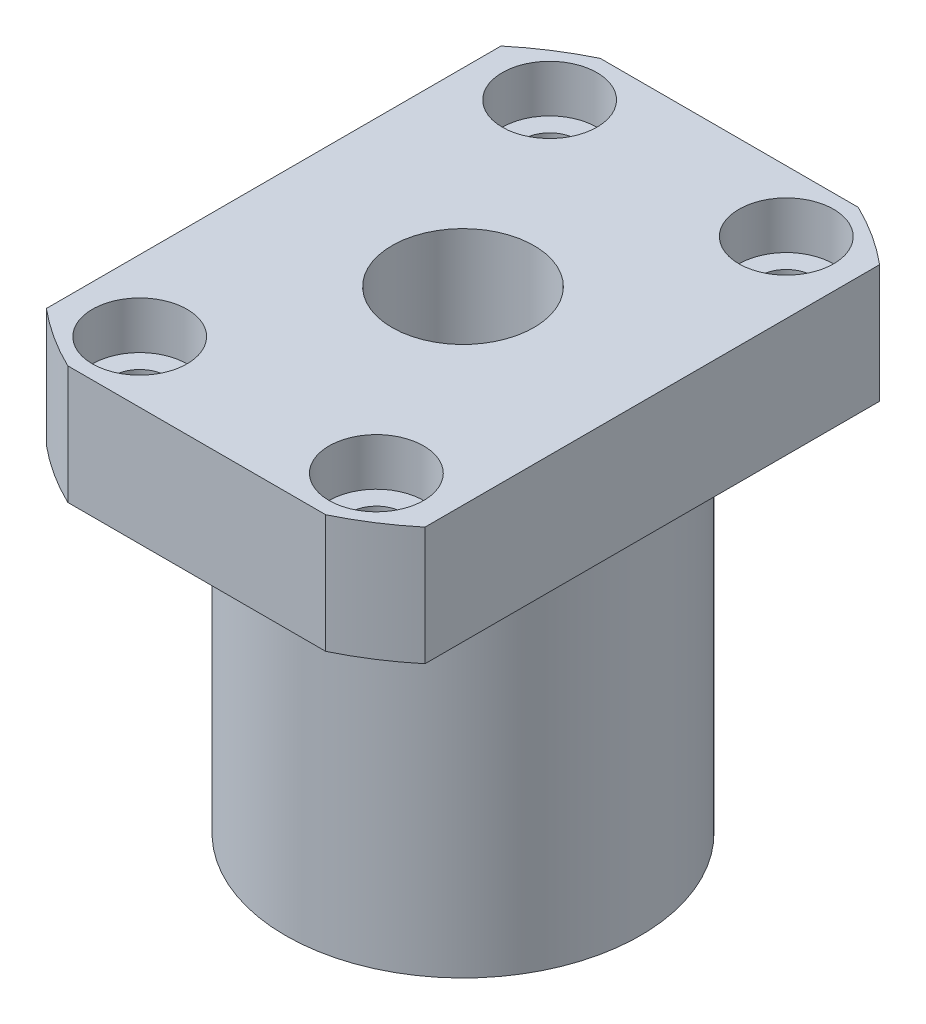
ISO-10303-21;
HEADER;
FILE_DESCRIPTION(('STEP AP214'),'2;1');
FILE_NAME('part.step','',(''),(''),'','','');
FILE_SCHEMA(('AUTOMOTIVE_DESIGN { 1 0 10303 214 1 1 1 1 }'));
ENDSEC;
DATA;
#1=APPLICATION_CONTEXT('core data for automotive mechanical design processes');
#2=APPLICATION_PROTOCOL_DEFINITION('international standard','automotive_design',2000,#1);
#3=PRODUCT_CONTEXT('',#1,'mechanical');
#4=PRODUCT('Part','Part','',(#3));
#5=PRODUCT_RELATED_PRODUCT_CATEGORY('part','',(#4));
#6=PRODUCT_DEFINITION_FORMATION('','',#4);
#7=PRODUCT_DEFINITION_CONTEXT('part definition',#1,'design');
#8=PRODUCT_DEFINITION('design','',#6,#7);
#9=PRODUCT_DEFINITION_SHAPE('','',#8);
#10=(LENGTH_UNIT() NAMED_UNIT(*) SI_UNIT(.MILLI.,.METRE.));
#11=(NAMED_UNIT(*) PLANE_ANGLE_UNIT() SI_UNIT($,.RADIAN.));
#12=(NAMED_UNIT(*) SI_UNIT($,.STERADIAN.) SOLID_ANGLE_UNIT());
#13=UNCERTAINTY_MEASURE_WITH_UNIT(LENGTH_MEASURE(1.E-05),#10,'distance_accuracy_value','');
#14=(GEOMETRIC_REPRESENTATION_CONTEXT(3) GLOBAL_UNCERTAINTY_ASSIGNED_CONTEXT((#13)) GLOBAL_UNIT_ASSIGNED_CONTEXT((#10,
#11,#12)) REPRESENTATION_CONTEXT('',''));
#15=CARTESIAN_POINT('',(0.,0.,0.));
#16=DIRECTION('',(0.,0.,1.));
#17=DIRECTION('',(1.,0.,0.));
#18=AXIS2_PLACEMENT_3D('',#15,#16,#17);
#19=CARTESIAN_POINT('',(0.,30.,0.));
#20=DIRECTION('',(0.,-1.,0.));
#21=DIRECTION('',(0.,0.,-1.));
#22=AXIS2_PLACEMENT_3D('',#19,#20,#21);
#23=PLANE('',#22);
#24=CARTESIAN_POINT('',(-10.,30.,-17.3205080756888));
#25=DIRECTION('',(0.,-1.,0.));
#26=DIRECTION('',(0.,0.,-1.));
#27=AXIS2_PLACEMENT_3D('',#24,#25,#26);
#28=CIRCLE('',#27,2.25);
#29=CARTESIAN_POINT('',(-10.,30.,-19.5705080756888));
#30=VERTEX_POINT('',#29);
#31=EDGE_CURVE('E160',#30,#30,#28,.T.);
#32=ORIENTED_EDGE('',*,*,#31,.F.);
#33=EDGE_LOOP('',(#32));
#34=FACE_BOUND('',#33,.T.);
#35=CARTESIAN_POINT('',(10.,30.,-17.3205080756888));
#36=DIRECTION('',(0.,-1.,0.));
#37=DIRECTION('',(0.,0.,-1.));
#38=AXIS2_PLACEMENT_3D('',#35,#36,#37);
#39=CIRCLE('',#38,2.25);
#40=CARTESIAN_POINT('',(10.,30.,-19.5705080756888));
#41=VERTEX_POINT('',#40);
#42=EDGE_CURVE('E156',#41,#41,#39,.T.);
#43=ORIENTED_EDGE('',*,*,#42,.F.);
#44=EDGE_LOOP('',(#43));
#45=FACE_BOUND('',#44,.T.);
#46=CARTESIAN_POINT('',(10.,30.,17.3205080756888));
#47=DIRECTION('',(0.,-1.,0.));
#48=DIRECTION('',(0.,0.,-1.));
#49=AXIS2_PLACEMENT_3D('',#46,#47,#48);
#50=CIRCLE('',#49,2.25);
#51=CARTESIAN_POINT('',(10.,30.,15.0705080756888));
#52=VERTEX_POINT('',#51);
#53=EDGE_CURVE('E151',#52,#52,#50,.T.);
#54=ORIENTED_EDGE('',*,*,#53,.F.);
#55=EDGE_LOOP('',(#54));
#56=FACE_BOUND('',#55,.T.);
#57=CARTESIAN_POINT('',(-10.,30.,17.3205080756888));
#58=DIRECTION('',(0.,-1.,0.));
#59=DIRECTION('',(0.,0.,-1.));
#60=AXIS2_PLACEMENT_3D('',#57,#58,#59);
#61=CIRCLE('',#60,2.25);
#62=CARTESIAN_POINT('',(-10.,30.,15.0705080756888));
#63=VERTEX_POINT('',#62);
#64=EDGE_CURVE('E138',#63,#63,#61,.T.);
#65=ORIENTED_EDGE('',*,*,#64,.F.);
#66=EDGE_LOOP('',(#65));
#67=FACE_BOUND('',#66,.T.);
#68=CARTESIAN_POINT('',(0.,30.,0.));
#69=DIRECTION('',(0.,1.,0.));
#70=DIRECTION('',(0.,0.,1.));
#71=AXIS2_PLACEMENT_3D('',#68,#69,#70);
#72=CIRCLE('',#71,15.);
#73=CARTESIAN_POINT('',(0.,30.,15.));
#74=VERTEX_POINT('',#73);
#75=EDGE_CURVE('E128',#74,#74,#72,.T.);
#76=ORIENTED_EDGE('',*,*,#75,.T.);
#77=EDGE_LOOP('',(#76));
#78=FACE_BOUND('',#77,.T.);
#79=DIRECTION('',(-1.,0.,0.));
#80=VECTOR('',#79,1.);
#81=CARTESIAN_POINT('',(-16.,30.,-22.5));
#82=LINE('',#81,#80);
#83=CARTESIAN_POINT('',(10.8972473588517,30.,-22.5));
#84=VERTEX_POINT('',#83);
#85=CARTESIAN_POINT('',(-10.8972473588517,30.,-22.5));
#86=VERTEX_POINT('',#85);
#87=EDGE_CURVE('E137',#84,#86,#82,.T.);
#88=ORIENTED_EDGE('',*,*,#87,.F.);
#89=CARTESIAN_POINT('',(0.,30.,0.));
#90=DIRECTION('',(0.,-1.,0.));
#91=DIRECTION('',(0.,0.,-1.));
#92=AXIS2_PLACEMENT_3D('',#89,#90,#91);
#93=CIRCLE('',#92,25.);
#94=CARTESIAN_POINT('',(16.,30.,-19.2093727122985));
#95=VERTEX_POINT('',#94);
#96=EDGE_CURVE('E210',#84,#95,#93,.T.);
#97=ORIENTED_EDGE('',*,*,#96,.T.);
#98=DIRECTION('',(0.,0.,-1.));
#99=VECTOR('',#98,1.);
#100=CARTESIAN_POINT('',(16.,30.,22.5));
#101=LINE('',#100,#99);
#102=CARTESIAN_POINT('',(16.,30.,19.2093727122985));
#103=VERTEX_POINT('',#102);
#104=EDGE_CURVE('E134',#103,#95,#101,.T.);
#105=ORIENTED_EDGE('',*,*,#104,.F.);
#106=CARTESIAN_POINT('',(10.8972473588517,30.,22.5));
#107=VERTEX_POINT('',#106);
#108=EDGE_CURVE('E119',#103,#107,#93,.T.);
#109=ORIENTED_EDGE('',*,*,#108,.T.);
#110=DIRECTION('',(1.,0.,0.));
#111=VECTOR('',#110,1.);
#112=CARTESIAN_POINT('',(-16.,30.,22.5));
#113=LINE('',#112,#111);
#114=CARTESIAN_POINT('',(-10.8972473588517,30.,22.5));
#115=VERTEX_POINT('',#114);
#116=EDGE_CURVE('E118',#115,#107,#113,.T.);
#117=ORIENTED_EDGE('',*,*,#116,.F.);
#118=CARTESIAN_POINT('',(-16.,30.,19.2093727122985));
#119=VERTEX_POINT('',#118);
#120=EDGE_CURVE('E213',#115,#119,#93,.T.);
#121=ORIENTED_EDGE('',*,*,#120,.T.);
#122=DIRECTION('',(0.,0.,1.));
#123=VECTOR('',#122,1.);
#124=CARTESIAN_POINT('',(-16.,30.,22.5));
#125=LINE('',#124,#123);
#126=CARTESIAN_POINT('',(-16.,30.,-19.2093727122985));
#127=VERTEX_POINT('',#126);
#128=EDGE_CURVE('E141',#127,#119,#125,.T.);
#129=ORIENTED_EDGE('',*,*,#128,.F.);
#130=EDGE_CURVE('E208',#127,#86,#93,.T.);
#131=ORIENTED_EDGE('',*,*,#130,.T.);
#132=EDGE_LOOP('',(#88,#97,#105,#109,#117,#121,#129,#131));
#133=FACE_BOUND('',#132,.T.);
#134=ADVANCED_FACE('F35',(#34,#45,#56,#67,#78,#133),#23,.T.);
#135=CARTESIAN_POINT('',(16.,40.,22.5));
#136=DIRECTION('',(-1.,0.,0.));
#137=DIRECTION('',(0.,0.,1.));
#138=AXIS2_PLACEMENT_3D('',#135,#136,#137);
#139=PLANE('',#138);
#140=DIRECTION('',(0.,1.,0.));
#141=VECTOR('',#140,1.);
#142=CARTESIAN_POINT('',(16.,10.,19.2093727122985));
#143=LINE('',#142,#141);
#144=CARTESIAN_POINT('',(16.,40.,19.2093727122985));
#145=VERTEX_POINT('',#144);
#146=EDGE_CURVE('E105',#103,#145,#143,.T.);
#147=ORIENTED_EDGE('',*,*,#146,.F.);
#148=ORIENTED_EDGE('',*,*,#104,.T.);
#149=DIRECTION('',(0.,1.,0.));
#150=VECTOR('',#149,1.);
#151=CARTESIAN_POINT('',(16.,10.,-19.2093727122985));
#152=LINE('',#151,#150);
#153=CARTESIAN_POINT('',(16.,40.,-19.2093727122986));
#154=VERTEX_POINT('',#153);
#155=EDGE_CURVE('E217',#154,#95,#152,.F.);
#156=ORIENTED_EDGE('',*,*,#155,.F.);
#157=DIRECTION('',(0.,0.,-1.));
#158=VECTOR('',#157,1.);
#159=CARTESIAN_POINT('',(16.,40.,22.5));
#160=LINE('',#159,#158);
#161=EDGE_CURVE('E145',#145,#154,#160,.T.);
#162=ORIENTED_EDGE('',*,*,#161,.F.);
#163=EDGE_LOOP('',(#147,#148,#156,#162));
#164=FACE_BOUND('',#163,.T.);
#165=ADVANCED_FACE('F251',(#164),#139,.F.);
#166=CARTESIAN_POINT('',(-16.,40.,-22.5));
#167=DIRECTION('',(0.,0.,1.));
#168=DIRECTION('',(1.,0.,0.));
#169=AXIS2_PLACEMENT_3D('',#166,#167,#168);
#170=PLANE('',#169);
#171=DIRECTION('',(0.,1.,0.));
#172=VECTOR('',#171,1.);
#173=CARTESIAN_POINT('',(10.8972473588517,10.,-22.5));
#174=LINE('',#173,#172);
#175=CARTESIAN_POINT('',(10.8972473588517,40.,-22.5));
#176=VERTEX_POINT('',#175);
#177=EDGE_CURVE('E204',#84,#176,#174,.T.);
#178=ORIENTED_EDGE('',*,*,#177,.F.);
#179=ORIENTED_EDGE('',*,*,#87,.T.);
#180=DIRECTION('',(0.,1.,0.));
#181=VECTOR('',#180,1.);
#182=CARTESIAN_POINT('',(-10.8972473588517,10.,-22.5));
#183=LINE('',#182,#181);
#184=CARTESIAN_POINT('',(-10.8972473588517,40.,-22.5));
#185=VERTEX_POINT('',#184);
#186=EDGE_CURVE('E206',#185,#86,#183,.F.);
#187=ORIENTED_EDGE('',*,*,#186,.F.);
#188=DIRECTION('',(-1.,0.,0.));
#189=VECTOR('',#188,1.);
#190=CARTESIAN_POINT('',(-16.,40.,-22.5));
#191=LINE('',#190,#189);
#192=EDGE_CURVE('E130',#176,#185,#191,.T.);
#193=ORIENTED_EDGE('',*,*,#192,.F.);
#194=EDGE_LOOP('',(#178,#179,#187,#193));
#195=FACE_BOUND('',#194,.T.);
#196=ADVANCED_FACE('F203',(#195),#170,.F.);
#197=CARTESIAN_POINT('',(-16.,40.,22.5));
#198=DIRECTION('',(1.,0.,0.));
#199=DIRECTION('',(0.,0.,-1.));
#200=AXIS2_PLACEMENT_3D('',#197,#198,#199);
#201=PLANE('',#200);
#202=DIRECTION('',(0.,1.,0.));
#203=VECTOR('',#202,1.);
#204=CARTESIAN_POINT('',(-16.,10.,-19.2093727122985));
#205=LINE('',#204,#203);
#206=CARTESIAN_POINT('',(-16.,40.,-19.2093727122985));
#207=VERTEX_POINT('',#206);
#208=EDGE_CURVE('E59',#127,#207,#205,.T.);
#209=ORIENTED_EDGE('',*,*,#208,.F.);
#210=ORIENTED_EDGE('',*,*,#128,.T.);
#211=DIRECTION('',(0.,1.,0.));
#212=VECTOR('',#211,1.);
#213=CARTESIAN_POINT('',(-16.,10.,19.2093727122985));
#214=LINE('',#213,#212);
#215=CARTESIAN_POINT('',(-16.,40.,19.2093727122986));
#216=VERTEX_POINT('',#215);
#217=EDGE_CURVE('E290',#216,#119,#214,.F.);
#218=ORIENTED_EDGE('',*,*,#217,.F.);
#219=DIRECTION('',(0.,0.,1.));
#220=VECTOR('',#219,1.);
#221=CARTESIAN_POINT('',(-16.,40.,22.5));
#222=LINE('',#221,#220);
#223=EDGE_CURVE('E125',#207,#216,#222,.T.);
#224=ORIENTED_EDGE('',*,*,#223,.F.);
#225=EDGE_LOOP('',(#209,#210,#218,#224));
#226=FACE_BOUND('',#225,.T.);
#227=ADVANCED_FACE('F264',(#226),#201,.F.);
#228=CARTESIAN_POINT('',(-16.,40.,22.5));
#229=DIRECTION('',(0.,0.,-1.));
#230=DIRECTION('',(-1.,0.,0.));
#231=AXIS2_PLACEMENT_3D('',#228,#229,#230);
#232=PLANE('',#231);
#233=DIRECTION('',(0.,1.,0.));
#234=VECTOR('',#233,1.);
#235=CARTESIAN_POINT('',(-10.8972473588517,10.,22.5));
#236=LINE('',#235,#234);
#237=CARTESIAN_POINT('',(-10.8972473588517,40.,22.5));
#238=VERTEX_POINT('',#237);
#239=EDGE_CURVE('E51',#115,#238,#236,.T.);
#240=ORIENTED_EDGE('',*,*,#239,.F.);
#241=ORIENTED_EDGE('',*,*,#116,.T.);
#242=DIRECTION('',(0.,1.,0.));
#243=VECTOR('',#242,1.);
#244=CARTESIAN_POINT('',(10.8972473588517,10.,22.5));
#245=LINE('',#244,#243);
#246=CARTESIAN_POINT('',(10.8972473588517,40.,22.5));
#247=VERTEX_POINT('',#246);
#248=EDGE_CURVE('E102',#247,#107,#245,.F.);
#249=ORIENTED_EDGE('',*,*,#248,.F.);
#250=DIRECTION('',(1.,0.,0.));
#251=VECTOR('',#250,1.);
#252=CARTESIAN_POINT('',(-16.,40.,22.5));
#253=LINE('',#252,#251);
#254=EDGE_CURVE('E116',#238,#247,#253,.T.);
#255=ORIENTED_EDGE('',*,*,#254,.F.);
#256=EDGE_LOOP('',(#240,#241,#249,#255));
#257=FACE_BOUND('',#256,.T.);
#258=ADVANCED_FACE('F115',(#257),#232,.F.);
#259=CARTESIAN_POINT('',(0.,40.,0.));
#260=DIRECTION('',(0.,-1.,0.));
#261=DIRECTION('',(0.,0.,-1.));
#262=AXIS2_PLACEMENT_3D('',#259,#260,#261);
#263=PLANE('',#262);
#264=CARTESIAN_POINT('',(0.,40.,0.));
#265=DIRECTION('',(0.,1.,0.));
#266=DIRECTION('',(0.,0.,1.));
#267=AXIS2_PLACEMENT_3D('',#264,#265,#266);
#268=CIRCLE('',#267,6.);
#269=CARTESIAN_POINT('',(0.,40.,6.));
#270=VERTEX_POINT('',#269);
#271=EDGE_CURVE('E284',#270,#270,#268,.T.);
#272=ORIENTED_EDGE('',*,*,#271,.F.);
#273=EDGE_LOOP('',(#272));
#274=FACE_BOUND('',#273,.T.);
#275=CARTESIAN_POINT('',(-10.,40.,-17.3205080756888));
#276=DIRECTION('',(0.,1.,0.));
#277=DIRECTION('',(0.,0.,1.));
#278=AXIS2_PLACEMENT_3D('',#275,#276,#277);
#279=CIRCLE('',#278,4.);
#280=CARTESIAN_POINT('',(-10.,40.,-13.3205080756888));
#281=VERTEX_POINT('',#280);
#282=EDGE_CURVE('E175',#281,#281,#279,.T.);
#283=ORIENTED_EDGE('',*,*,#282,.F.);
#284=EDGE_LOOP('',(#283));
#285=FACE_BOUND('',#284,.T.);
#286=CARTESIAN_POINT('',(10.,40.,-17.3205080756888));
#287=DIRECTION('',(0.,1.,0.));
#288=DIRECTION('',(0.,0.,1.));
#289=AXIS2_PLACEMENT_3D('',#286,#287,#288);
#290=CIRCLE('',#289,4.);
#291=CARTESIAN_POINT('',(10.,40.,-13.3205080756888));
#292=VERTEX_POINT('',#291);
#293=EDGE_CURVE('E162',#292,#292,#290,.T.);
#294=ORIENTED_EDGE('',*,*,#293,.F.);
#295=EDGE_LOOP('',(#294));
#296=FACE_BOUND('',#295,.T.);
#297=CARTESIAN_POINT('',(10.,40.,17.3205080756888));
#298=DIRECTION('',(0.,1.,0.));
#299=DIRECTION('',(0.,0.,1.));
#300=AXIS2_PLACEMENT_3D('',#297,#298,#299);
#301=CIRCLE('',#300,4.);
#302=CARTESIAN_POINT('',(10.,40.,21.3205080756888));
#303=VERTEX_POINT('',#302);
#304=EDGE_CURVE('E158',#303,#303,#301,.T.);
#305=ORIENTED_EDGE('',*,*,#304,.F.);
#306=EDGE_LOOP('',(#305));
#307=FACE_BOUND('',#306,.T.);
#308=CARTESIAN_POINT('',(-10.,40.,17.3205080756888));
#309=DIRECTION('',(0.,1.,0.));
#310=DIRECTION('',(0.,0.,1.));
#311=AXIS2_PLACEMENT_3D('',#308,#309,#310);
#312=CIRCLE('',#311,4.);
#313=CARTESIAN_POINT('',(-10.,40.,21.3205080756888));
#314=VERTEX_POINT('',#313);
#315=EDGE_CURVE('E154',#314,#314,#312,.T.);
#316=ORIENTED_EDGE('',*,*,#315,.F.);
#317=EDGE_LOOP('',(#316));
#318=FACE_BOUND('',#317,.T.);
#319=CARTESIAN_POINT('',(0.,40.,0.));
#320=DIRECTION('',(0.,-1.,0.));
#321=DIRECTION('',(0.,0.,-1.));
#322=AXIS2_PLACEMENT_3D('',#319,#320,#321);
#323=CIRCLE('',#322,25.);
#324=EDGE_CURVE('E11',#176,#154,#323,.T.);
#325=ORIENTED_EDGE('',*,*,#324,.F.);
#326=ORIENTED_EDGE('',*,*,#192,.T.);
#327=EDGE_CURVE('E39',#207,#185,#323,.T.);
#328=ORIENTED_EDGE('',*,*,#327,.F.);
#329=ORIENTED_EDGE('',*,*,#223,.T.);
#330=EDGE_CURVE('E44',#238,#216,#323,.T.);
#331=ORIENTED_EDGE('',*,*,#330,.F.);
#332=ORIENTED_EDGE('',*,*,#254,.T.);
#333=CARTESIAN_POINT('',(0.,40.,0.));
#334=DIRECTION('',(0.,1.,0.));
#335=DIRECTION('',(0.,0.,1.));
#336=AXIS2_PLACEMENT_3D('',#333,#334,#335);
#337=CIRCLE('',#336,25.);
#338=EDGE_CURVE('E99',#247,#145,#337,.T.);
#339=ORIENTED_EDGE('',*,*,#338,.T.);
#340=ORIENTED_EDGE('',*,*,#161,.T.);
#341=EDGE_LOOP('',(#325,#326,#328,#329,#331,#332,#339,#340));
#342=FACE_BOUND('',#341,.T.);
#343=ADVANCED_FACE('F122',(#274,#285,#296,#307,#318,#342),#263,.F.);
#344=CARTESIAN_POINT('',(0.,30.,0.));
#345=DIRECTION('',(0.,-1.,0.));
#346=DIRECTION('',(0.,0.,-1.));
#347=AXIS2_PLACEMENT_3D('',#344,#345,#346);
#348=CYLINDRICAL_SURFACE('',#347,15.);
#349=ORIENTED_EDGE('',*,*,#75,.F.);
#350=EDGE_LOOP('',(#349));
#351=FACE_BOUND('',#350,.T.);
#352=CARTESIAN_POINT('',(0.,0.,0.));
#353=DIRECTION('',(0.,1.,0.));
#354=DIRECTION('',(0.,0.,1.));
#355=AXIS2_PLACEMENT_3D('',#352,#353,#354);
#356=CIRCLE('',#355,15.);
#357=CARTESIAN_POINT('',(0.,0.,15.));
#358=VERTEX_POINT('',#357);
#359=EDGE_CURVE('E124',#358,#358,#356,.T.);
#360=ORIENTED_EDGE('',*,*,#359,.T.);
#361=EDGE_LOOP('',(#360));
#362=FACE_BOUND('',#361,.T.);
#363=ADVANCED_FACE('F37',(#351,#362),#348,.T.);
#364=CARTESIAN_POINT('',(0.,0.,0.));
#365=DIRECTION('',(0.,1.,0.));
#366=DIRECTION('',(0.,0.,1.));
#367=AXIS2_PLACEMENT_3D('',#364,#365,#366);
#368=PLANE('',#367);
#369=CARTESIAN_POINT('',(0.,0.,0.));
#370=DIRECTION('',(0.,1.,0.));
#371=DIRECTION('',(0.,0.,1.));
#372=AXIS2_PLACEMENT_3D('',#369,#370,#371);
#373=CIRCLE('',#372,6.);
#374=CARTESIAN_POINT('',(0.,0.,6.));
#375=VERTEX_POINT('',#374);
#376=EDGE_CURVE('E110',#375,#375,#373,.T.);
#377=ORIENTED_EDGE('',*,*,#376,.T.);
#378=EDGE_LOOP('',(#377));
#379=FACE_BOUND('',#378,.T.);
#380=ORIENTED_EDGE('',*,*,#359,.F.);
#381=EDGE_LOOP('',(#380));
#382=FACE_BOUND('',#381,.T.);
#383=ADVANCED_FACE('F269',(#379,#382),#368,.F.);
#384=CARTESIAN_POINT('',(-10.,40.,17.3205080756888));
#385=DIRECTION('',(0.,1.,0.));
#386=DIRECTION('',(0.,0.,1.));
#387=AXIS2_PLACEMENT_3D('',#384,#385,#386);
#388=CYLINDRICAL_SURFACE('',#387,2.25);
#389=ORIENTED_EDGE('',*,*,#64,.T.);
#390=EDGE_LOOP('',(#389));
#391=FACE_BOUND('',#390,.T.);
#392=CARTESIAN_POINT('',(-10.,36.,17.3205080756888));
#393=DIRECTION('',(0.,1.,0.));
#394=DIRECTION('',(0.,0.,1.));
#395=AXIS2_PLACEMENT_3D('',#392,#393,#394);
#396=CIRCLE('',#395,2.25);
#397=CARTESIAN_POINT('',(-10.,36.,19.5705080756888));
#398=VERTEX_POINT('',#397);
#399=EDGE_CURVE('E150',#398,#398,#396,.T.);
#400=ORIENTED_EDGE('',*,*,#399,.T.);
#401=EDGE_LOOP('',(#400));
#402=FACE_BOUND('',#401,.T.);
#403=ADVANCED_FACE('F246',(#391,#402),#388,.F.);
#404=CARTESIAN_POINT('',(-7.75000000000001,36.,17.3205080756888));
#405=DIRECTION('',(0.,-1.,0.));
#406=DIRECTION('',(0.,0.,-1.));
#407=AXIS2_PLACEMENT_3D('',#404,#405,#406);
#408=PLANE('',#407);
#409=ORIENTED_EDGE('',*,*,#399,.F.);
#410=EDGE_LOOP('',(#409));
#411=FACE_BOUND('',#410,.T.);
#412=CARTESIAN_POINT('',(-10.,36.,17.3205080756888));
#413=DIRECTION('',(0.,1.,0.));
#414=DIRECTION('',(0.,0.,1.));
#415=AXIS2_PLACEMENT_3D('',#412,#413,#414);
#416=CIRCLE('',#415,4.);
#417=CARTESIAN_POINT('',(-10.,36.,21.3205080756888));
#418=VERTEX_POINT('',#417);
#419=EDGE_CURVE('E192',#418,#418,#416,.T.);
#420=ORIENTED_EDGE('',*,*,#419,.T.);
#421=EDGE_LOOP('',(#420));
#422=FACE_BOUND('',#421,.T.);
#423=ADVANCED_FACE('F236',(#411,#422),#408,.F.);
#424=CARTESIAN_POINT('',(-10.,40.,17.3205080756888));
#425=DIRECTION('',(0.,1.,0.));
#426=DIRECTION('',(0.,0.,1.));
#427=AXIS2_PLACEMENT_3D('',#424,#425,#426);
#428=CYLINDRICAL_SURFACE('',#427,4.);
#429=ORIENTED_EDGE('',*,*,#419,.F.);
#430=EDGE_LOOP('',(#429));
#431=FACE_BOUND('',#430,.T.);
#432=ORIENTED_EDGE('',*,*,#315,.T.);
#433=EDGE_LOOP('',(#432));
#434=FACE_BOUND('',#433,.T.);
#435=ADVANCED_FACE('F233',(#431,#434),#428,.F.);
#436=CARTESIAN_POINT('',(10.,40.,17.3205080756888));
#437=DIRECTION('',(0.,1.,0.));
#438=DIRECTION('',(0.,0.,1.));
#439=AXIS2_PLACEMENT_3D('',#436,#437,#438);
#440=CYLINDRICAL_SURFACE('',#439,2.25);
#441=ORIENTED_EDGE('',*,*,#53,.T.);
#442=EDGE_LOOP('',(#441));
#443=FACE_BOUND('',#442,.T.);
#444=CARTESIAN_POINT('',(10.,36.,17.3205080756888));
#445=DIRECTION('',(0.,1.,0.));
#446=DIRECTION('',(0.,0.,1.));
#447=AXIS2_PLACEMENT_3D('',#444,#445,#446);
#448=CIRCLE('',#447,2.25);
#449=CARTESIAN_POINT('',(10.,36.,19.5705080756888));
#450=VERTEX_POINT('',#449);
#451=EDGE_CURVE('E155',#450,#450,#448,.T.);
#452=ORIENTED_EDGE('',*,*,#451,.T.);
#453=EDGE_LOOP('',(#452));
#454=FACE_BOUND('',#453,.T.);
#455=ADVANCED_FACE('F235',(#443,#454),#440,.F.);
#456=CARTESIAN_POINT('',(12.25,36.,17.3205080756888));
#457=DIRECTION('',(0.,-1.,0.));
#458=DIRECTION('',(0.,0.,-1.));
#459=AXIS2_PLACEMENT_3D('',#456,#457,#458);
#460=PLANE('',#459);
#461=ORIENTED_EDGE('',*,*,#451,.F.);
#462=EDGE_LOOP('',(#461));
#463=FACE_BOUND('',#462,.T.);
#464=CARTESIAN_POINT('',(10.,36.,17.3205080756888));
#465=DIRECTION('',(0.,1.,0.));
#466=DIRECTION('',(0.,0.,1.));
#467=AXIS2_PLACEMENT_3D('',#464,#465,#466);
#468=CIRCLE('',#467,4.);
#469=CARTESIAN_POINT('',(10.,36.,21.3205080756888));
#470=VERTEX_POINT('',#469);
#471=EDGE_CURVE('E185',#470,#470,#468,.T.);
#472=ORIENTED_EDGE('',*,*,#471,.T.);
#473=EDGE_LOOP('',(#472));
#474=FACE_BOUND('',#473,.T.);
#475=ADVANCED_FACE('F243',(#463,#474),#460,.F.);
#476=CARTESIAN_POINT('',(10.,40.,17.3205080756888));
#477=DIRECTION('',(0.,1.,0.));
#478=DIRECTION('',(0.,0.,1.));
#479=AXIS2_PLACEMENT_3D('',#476,#477,#478);
#480=CYLINDRICAL_SURFACE('',#479,4.);
#481=ORIENTED_EDGE('',*,*,#471,.F.);
#482=EDGE_LOOP('',(#481));
#483=FACE_BOUND('',#482,.T.);
#484=ORIENTED_EDGE('',*,*,#304,.T.);
#485=EDGE_LOOP('',(#484));
#486=FACE_BOUND('',#485,.T.);
#487=ADVANCED_FACE('F330',(#483,#486),#480,.F.);
#488=CARTESIAN_POINT('',(10.,40.,-17.3205080756888));
#489=DIRECTION('',(0.,1.,0.));
#490=DIRECTION('',(0.,0.,1.));
#491=AXIS2_PLACEMENT_3D('',#488,#489,#490);
#492=CYLINDRICAL_SURFACE('',#491,2.25);
#493=ORIENTED_EDGE('',*,*,#42,.T.);
#494=EDGE_LOOP('',(#493));
#495=FACE_BOUND('',#494,.T.);
#496=CARTESIAN_POINT('',(10.,36.,-17.3205080756888));
#497=DIRECTION('',(0.,1.,0.));
#498=DIRECTION('',(0.,0.,1.));
#499=AXIS2_PLACEMENT_3D('',#496,#497,#498);
#500=CIRCLE('',#499,2.25);
#501=CARTESIAN_POINT('',(10.,36.,-15.0705080756888));
#502=VERTEX_POINT('',#501);
#503=EDGE_CURVE('E159',#502,#502,#500,.T.);
#504=ORIENTED_EDGE('',*,*,#503,.T.);
#505=EDGE_LOOP('',(#504));
#506=FACE_BOUND('',#505,.T.);
#507=ADVANCED_FACE('F326',(#495,#506),#492,.F.);
#508=CARTESIAN_POINT('',(12.25,36.,-17.3205080756888));
#509=DIRECTION('',(0.,-1.,0.));
#510=DIRECTION('',(0.,0.,-1.));
#511=AXIS2_PLACEMENT_3D('',#508,#509,#510);
#512=PLANE('',#511);
#513=ORIENTED_EDGE('',*,*,#503,.F.);
#514=EDGE_LOOP('',(#513));
#515=FACE_BOUND('',#514,.T.);
#516=CARTESIAN_POINT('',(10.,36.,-17.3205080756888));
#517=DIRECTION('',(0.,1.,0.));
#518=DIRECTION('',(0.,0.,1.));
#519=AXIS2_PLACEMENT_3D('',#516,#517,#518);
#520=CIRCLE('',#519,4.);
#521=CARTESIAN_POINT('',(10.,36.,-13.3205080756888));
#522=VERTEX_POINT('',#521);
#523=EDGE_CURVE('E167',#522,#522,#520,.T.);
#524=ORIENTED_EDGE('',*,*,#523,.T.);
#525=EDGE_LOOP('',(#524));
#526=FACE_BOUND('',#525,.T.);
#527=ADVANCED_FACE('F322',(#515,#526),#512,.F.);
#528=CARTESIAN_POINT('',(10.,40.,-17.3205080756888));
#529=DIRECTION('',(0.,1.,0.));
#530=DIRECTION('',(0.,0.,1.));
#531=AXIS2_PLACEMENT_3D('',#528,#529,#530);
#532=CYLINDRICAL_SURFACE('',#531,4.);
#533=ORIENTED_EDGE('',*,*,#523,.F.);
#534=EDGE_LOOP('',(#533));
#535=FACE_BOUND('',#534,.T.);
#536=ORIENTED_EDGE('',*,*,#293,.T.);
#537=EDGE_LOOP('',(#536));
#538=FACE_BOUND('',#537,.T.);
#539=ADVANCED_FACE('F319',(#535,#538),#532,.F.);
#540=CARTESIAN_POINT('',(-10.,40.,-17.3205080756888));
#541=DIRECTION('',(0.,1.,0.));
#542=DIRECTION('',(0.,0.,1.));
#543=AXIS2_PLACEMENT_3D('',#540,#541,#542);
#544=CYLINDRICAL_SURFACE('',#543,2.25);
#545=ORIENTED_EDGE('',*,*,#31,.T.);
#546=EDGE_LOOP('',(#545));
#547=FACE_BOUND('',#546,.T.);
#548=CARTESIAN_POINT('',(-10.,36.,-17.3205080756888));
#549=DIRECTION('',(0.,1.,0.));
#550=DIRECTION('',(0.,0.,1.));
#551=AXIS2_PLACEMENT_3D('',#548,#549,#550);
#552=CIRCLE('',#551,2.25);
#553=CARTESIAN_POINT('',(-10.,36.,-15.0705080756888));
#554=VERTEX_POINT('',#553);
#555=EDGE_CURVE('E163',#554,#554,#552,.T.);
#556=ORIENTED_EDGE('',*,*,#555,.T.);
#557=EDGE_LOOP('',(#556));
#558=FACE_BOUND('',#557,.T.);
#559=ADVANCED_FACE('F315',(#547,#558),#544,.F.);
#560=CARTESIAN_POINT('',(-7.75000000000002,36.,-17.3205080756888));
#561=DIRECTION('',(0.,-1.,0.));
#562=DIRECTION('',(0.,0.,-1.));
#563=AXIS2_PLACEMENT_3D('',#560,#561,#562);
#564=PLANE('',#563);
#565=ORIENTED_EDGE('',*,*,#555,.F.);
#566=EDGE_LOOP('',(#565));
#567=FACE_BOUND('',#566,.T.);
#568=CARTESIAN_POINT('',(-10.,36.,-17.3205080756888));
#569=DIRECTION('',(0.,1.,0.));
#570=DIRECTION('',(0.,0.,1.));
#571=AXIS2_PLACEMENT_3D('',#568,#569,#570);
#572=CIRCLE('',#571,4.);
#573=CARTESIAN_POINT('',(-10.,36.,-13.3205080756888));
#574=VERTEX_POINT('',#573);
#575=EDGE_CURVE('E170',#574,#574,#572,.T.);
#576=ORIENTED_EDGE('',*,*,#575,.T.);
#577=EDGE_LOOP('',(#576));
#578=FACE_BOUND('',#577,.T.);
#579=ADVANCED_FACE('F311',(#567,#578),#564,.F.);
#580=CARTESIAN_POINT('',(-10.,40.,-17.3205080756888));
#581=DIRECTION('',(0.,1.,0.));
#582=DIRECTION('',(0.,0.,1.));
#583=AXIS2_PLACEMENT_3D('',#580,#581,#582);
#584=CYLINDRICAL_SURFACE('',#583,4.);
#585=ORIENTED_EDGE('',*,*,#575,.F.);
#586=EDGE_LOOP('',(#585));
#587=FACE_BOUND('',#586,.T.);
#588=ORIENTED_EDGE('',*,*,#282,.T.);
#589=EDGE_LOOP('',(#588));
#590=FACE_BOUND('',#589,.T.);
#591=ADVANCED_FACE('F221',(#587,#590),#584,.F.);
#592=CARTESIAN_POINT('',(0.,10.,0.));
#593=DIRECTION('',(0.,1.,0.));
#594=DIRECTION('',(0.,0.,1.));
#595=AXIS2_PLACEMENT_3D('',#592,#593,#594);
#596=CYLINDRICAL_SURFACE('',#595,25.);
#597=ORIENTED_EDGE('',*,*,#186,.T.);
#598=ORIENTED_EDGE('',*,*,#130,.F.);
#599=ORIENTED_EDGE('',*,*,#208,.T.);
#600=ORIENTED_EDGE('',*,*,#327,.T.);
#601=EDGE_LOOP('',(#597,#598,#599,#600));
#602=FACE_BOUND('',#601,.T.);
#603=ADVANCED_FACE('F297',(#602),#596,.T.);
#604=ORIENTED_EDGE('',*,*,#217,.T.);
#605=ORIENTED_EDGE('',*,*,#120,.F.);
#606=ORIENTED_EDGE('',*,*,#239,.T.);
#607=ORIENTED_EDGE('',*,*,#330,.T.);
#608=EDGE_LOOP('',(#604,#605,#606,#607));
#609=FACE_BOUND('',#608,.T.);
#610=ADVANCED_FACE('F295',(#609),#596,.T.);
#611=ORIENTED_EDGE('',*,*,#146,.T.);
#612=ORIENTED_EDGE('',*,*,#338,.F.);
#613=ORIENTED_EDGE('',*,*,#248,.T.);
#614=ORIENTED_EDGE('',*,*,#108,.F.);
#615=EDGE_LOOP('',(#611,#612,#613,#614));
#616=FACE_BOUND('',#615,.T.);
#617=ADVANCED_FACE('F101',(#616),#596,.T.);
#618=ORIENTED_EDGE('',*,*,#155,.T.);
#619=ORIENTED_EDGE('',*,*,#96,.F.);
#620=ORIENTED_EDGE('',*,*,#177,.T.);
#621=ORIENTED_EDGE('',*,*,#324,.T.);
#622=EDGE_LOOP('',(#618,#619,#620,#621));
#623=FACE_BOUND('',#622,.T.);
#624=ADVANCED_FACE('F303',(#623),#596,.T.);
#625=CARTESIAN_POINT('',(0.,0.,0.));
#626=DIRECTION('',(0.,1.,0.));
#627=DIRECTION('',(0.,0.,1.));
#628=AXIS2_PLACEMENT_3D('',#625,#626,#627);
#629=CYLINDRICAL_SURFACE('',#628,6.);
#630=ORIENTED_EDGE('',*,*,#376,.F.);
#631=EDGE_LOOP('',(#630));
#632=FACE_BOUND('',#631,.T.);
#633=ORIENTED_EDGE('',*,*,#271,.T.);
#634=EDGE_LOOP('',(#633));
#635=FACE_BOUND('',#634,.T.);
#636=ADVANCED_FACE('F307',(#632,#635),#629,.F.);
#637=CLOSED_SHELL('',(#134,#165,#196,#227,#258,#343,#363,#383,#403,#423,#435,#455,#475,#487,
#507,#527,#539,#559,#579,#591,#603,#610,#617,#624,#636));
#638=MANIFOLD_SOLID_BREP('B2',#637);
#639=ADVANCED_BREP_SHAPE_REPRESENTATION('',(#18,#638),#14);
#640=SHAPE_DEFINITION_REPRESENTATION(#9,#639);
ENDSEC;
END-ISO-10303-21;
